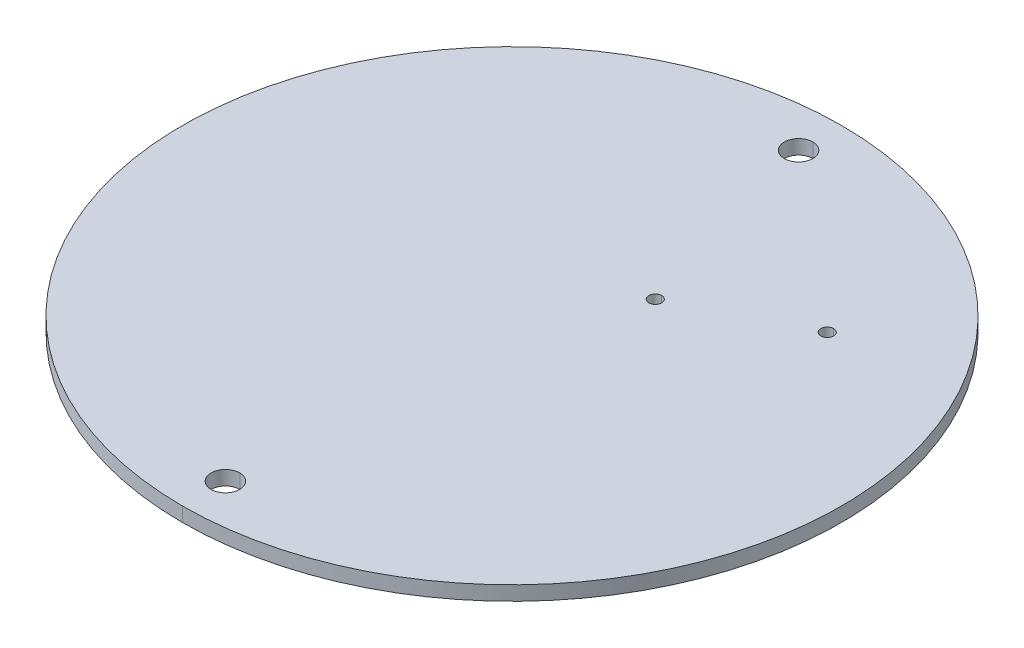
ISO-10303-21;
HEADER;
FILE_DESCRIPTION(('STEP AP214'),'2;1');
FILE_NAME('part.step','',(''),(''),'','','');
FILE_SCHEMA(('AUTOMOTIVE_DESIGN { 1 0 10303 214 1 1 1 1 }'));
ENDSEC;
DATA;
#1=APPLICATION_CONTEXT('core data for automotive mechanical design processes');
#2=APPLICATION_PROTOCOL_DEFINITION('international standard','automotive_design',2000,#1);
#3=PRODUCT_CONTEXT('',#1,'mechanical');
#4=PRODUCT('Part','Part','',(#3));
#5=PRODUCT_RELATED_PRODUCT_CATEGORY('part','',(#4));
#6=PRODUCT_DEFINITION_FORMATION('','',#4);
#7=PRODUCT_DEFINITION_CONTEXT('part definition',#1,'design');
#8=PRODUCT_DEFINITION('design','',#6,#7);
#9=PRODUCT_DEFINITION_SHAPE('','',#8);
#10=(LENGTH_UNIT() NAMED_UNIT(*) SI_UNIT(.MILLI.,.METRE.));
#11=(NAMED_UNIT(*) PLANE_ANGLE_UNIT() SI_UNIT($,.RADIAN.));
#12=(NAMED_UNIT(*) SI_UNIT($,.STERADIAN.) SOLID_ANGLE_UNIT());
#13=UNCERTAINTY_MEASURE_WITH_UNIT(LENGTH_MEASURE(1.E-05),#10,'distance_accuracy_value','');
#14=(GEOMETRIC_REPRESENTATION_CONTEXT(3) GLOBAL_UNCERTAINTY_ASSIGNED_CONTEXT((#13)) GLOBAL_UNIT_ASSIGNED_CONTEXT((#10,
#11,#12)) REPRESENTATION_CONTEXT('',''));
#15=CARTESIAN_POINT('',(0.,0.,0.));
#16=DIRECTION('',(0.,0.,1.));
#17=DIRECTION('',(1.,0.,0.));
#18=AXIS2_PLACEMENT_3D('',#15,#16,#17);
#19=CARTESIAN_POINT('',(12.7,0.,-19.05));
#20=DIRECTION('',(0.,1.,0.));
#21=DIRECTION('',(0.,0.,1.));
#22=AXIS2_PLACEMENT_3D('',#19,#20,#21);
#23=CYLINDRICAL_SURFACE('',#22,1.4224);
#24=DIRECTION('',(0.,1.,0.));
#25=VECTOR('',#24,1.);
#26=CARTESIAN_POINT('',(12.7,0.,-20.4724));
#27=LINE('',#26,#25);
#28=CARTESIAN_POINT('',(12.7,0.,-20.4724));
#29=VERTEX_POINT('',#28);
#30=CARTESIAN_POINT('',(12.7,3.175,-20.4724));
#31=VERTEX_POINT('',#30);
#32=EDGE_CURVE('E155',#29,#31,#27,.T.);
#33=ORIENTED_EDGE('',*,*,#32,.F.);
#34=CARTESIAN_POINT('',(12.7,0.,-19.05));
#35=DIRECTION('',(0.,1.,0.));
#36=DIRECTION('',(0.,0.,1.));
#37=AXIS2_PLACEMENT_3D('',#34,#35,#36);
#38=CIRCLE('',#37,1.4224);
#39=CARTESIAN_POINT('',(12.7,0.,-17.6276));
#40=VERTEX_POINT('',#39);
#41=EDGE_CURVE('E150',#40,#29,#38,.T.);
#42=ORIENTED_EDGE('',*,*,#41,.F.);
#43=DIRECTION('',(0.,1.,0.));
#44=VECTOR('',#43,1.);
#45=CARTESIAN_POINT('',(12.7,0.,-17.6276));
#46=LINE('',#45,#44);
#47=CARTESIAN_POINT('',(12.7,3.175,-17.6276));
#48=VERTEX_POINT('',#47);
#49=EDGE_CURVE('E132',#40,#48,#46,.T.);
#50=ORIENTED_EDGE('',*,*,#49,.T.);
#51=CARTESIAN_POINT('',(12.7,3.175,-19.05));
#52=DIRECTION('',(0.,1.,0.));
#53=DIRECTION('',(0.,0.,1.));
#54=AXIS2_PLACEMENT_3D('',#51,#52,#53);
#55=CIRCLE('',#54,1.4224);
#56=EDGE_CURVE('E169',#48,#31,#55,.T.);
#57=ORIENTED_EDGE('',*,*,#56,.T.);
#58=EDGE_LOOP('',(#33,#42,#50,#57));
#59=FACE_BOUND('',#58,.T.);
#60=ADVANCED_FACE('F16',(#59),#23,.F.);
#61=CARTESIAN_POINT('',(38.1,0.,-31.75));
#62=DIRECTION('',(0.,1.,0.));
#63=DIRECTION('',(0.,0.,1.));
#64=AXIS2_PLACEMENT_3D('',#61,#62,#63);
#65=CYLINDRICAL_SURFACE('',#64,1.4224);
#66=DIRECTION('',(0.,1.,0.));
#67=VECTOR('',#66,1.);
#68=CARTESIAN_POINT('',(38.1,0.,-33.1724));
#69=LINE('',#68,#67);
#70=CARTESIAN_POINT('',(38.1,0.,-33.1724));
#71=VERTEX_POINT('',#70);
#72=CARTESIAN_POINT('',(38.1,3.175,-33.1724));
#73=VERTEX_POINT('',#72);
#74=EDGE_CURVE('E143',#71,#73,#69,.T.);
#75=ORIENTED_EDGE('',*,*,#74,.F.);
#76=CARTESIAN_POINT('',(38.1,0.,-31.75));
#77=DIRECTION('',(0.,1.,0.));
#78=DIRECTION('',(0.,0.,1.));
#79=AXIS2_PLACEMENT_3D('',#76,#77,#78);
#80=CIRCLE('',#79,1.4224);
#81=CARTESIAN_POINT('',(38.1,0.,-30.3276));
#82=VERTEX_POINT('',#81);
#83=EDGE_CURVE('E181',#82,#71,#80,.T.);
#84=ORIENTED_EDGE('',*,*,#83,.F.);
#85=DIRECTION('',(0.,1.,0.));
#86=VECTOR('',#85,1.);
#87=CARTESIAN_POINT('',(38.1,0.,-30.3276));
#88=LINE('',#87,#86);
#89=CARTESIAN_POINT('',(38.1,3.175,-30.3276));
#90=VERTEX_POINT('',#89);
#91=EDGE_CURVE('E175',#82,#90,#88,.T.);
#92=ORIENTED_EDGE('',*,*,#91,.T.);
#93=CARTESIAN_POINT('',(38.1,3.175,-31.75));
#94=DIRECTION('',(0.,1.,0.));
#95=DIRECTION('',(0.,0.,1.));
#96=AXIS2_PLACEMENT_3D('',#93,#94,#95);
#97=CIRCLE('',#96,1.4224);
#98=EDGE_CURVE('E166',#90,#73,#97,.T.);
#99=ORIENTED_EDGE('',*,*,#98,.T.);
#100=EDGE_LOOP('',(#75,#84,#92,#99));
#101=FACE_BOUND('',#100,.T.);
#102=ADVANCED_FACE('F251',(#101),#65,.F.);
#103=CARTESIAN_POINT('',(0.,0.,63.5));
#104=DIRECTION('',(0.,1.,0.));
#105=DIRECTION('',(0.,0.,1.));
#106=AXIS2_PLACEMENT_3D('',#103,#104,#105);
#107=CYLINDRICAL_SURFACE('',#106,3.175);
#108=DIRECTION('',(0.,1.,0.));
#109=VECTOR('',#108,1.);
#110=CARTESIAN_POINT('',(0.,0.,60.325));
#111=LINE('',#110,#109);
#112=CARTESIAN_POINT('',(0.,0.,60.325));
#113=VERTEX_POINT('',#112);
#114=CARTESIAN_POINT('',(0.,3.175,60.325));
#115=VERTEX_POINT('',#114);
#116=EDGE_CURVE('E180',#113,#115,#111,.T.);
#117=ORIENTED_EDGE('',*,*,#116,.F.);
#118=CARTESIAN_POINT('',(0.,0.,63.5));
#119=DIRECTION('',(0.,1.,0.));
#120=DIRECTION('',(0.,0.,1.));
#121=AXIS2_PLACEMENT_3D('',#118,#119,#120);
#122=CIRCLE('',#121,3.175);
#123=CARTESIAN_POINT('',(0.,0.,66.675));
#124=VERTEX_POINT('',#123);
#125=EDGE_CURVE('E27',#124,#113,#122,.T.);
#126=ORIENTED_EDGE('',*,*,#125,.F.);
#127=DIRECTION('',(0.,1.,0.));
#128=VECTOR('',#127,1.);
#129=CARTESIAN_POINT('',(0.,0.,66.675));
#130=LINE('',#129,#128);
#131=CARTESIAN_POINT('',(0.,3.175,66.675));
#132=VERTEX_POINT('',#131);
#133=EDGE_CURVE('E122',#124,#132,#130,.T.);
#134=ORIENTED_EDGE('',*,*,#133,.T.);
#135=CARTESIAN_POINT('',(0.,3.175,63.5));
#136=DIRECTION('',(0.,1.,0.));
#137=DIRECTION('',(0.,0.,1.));
#138=AXIS2_PLACEMENT_3D('',#135,#136,#137);
#139=CIRCLE('',#138,3.175);
#140=EDGE_CURVE('E20',#132,#115,#139,.T.);
#141=ORIENTED_EDGE('',*,*,#140,.T.);
#142=EDGE_LOOP('',(#117,#126,#134,#141));
#143=FACE_BOUND('',#142,.T.);
#144=ADVANCED_FACE('F277',(#143),#107,.F.);
#145=CARTESIAN_POINT('',(4.43418130033078E-13,0.,-63.5));
#146=DIRECTION('',(0.,1.,0.));
#147=DIRECTION('',(0.,0.,1.));
#148=AXIS2_PLACEMENT_3D('',#145,#146,#147);
#149=CYLINDRICAL_SURFACE('',#148,3.175);
#150=DIRECTION('',(0.,1.,0.));
#151=VECTOR('',#150,1.);
#152=CARTESIAN_POINT('',(4.43806955391807E-13,0.,-66.675));
#153=LINE('',#152,#151);
#154=CARTESIAN_POINT('',(4.43806955391807E-13,0.,-66.675));
#155=VERTEX_POINT('',#154);
#156=CARTESIAN_POINT('',(4.43806955391807E-13,3.175,-66.675));
#157=VERTEX_POINT('',#156);
#158=EDGE_CURVE('E109',#155,#157,#153,.T.);
#159=ORIENTED_EDGE('',*,*,#158,.F.);
#160=CARTESIAN_POINT('',(4.43418130033078E-13,0.,-63.5));
#161=DIRECTION('',(0.,1.,0.));
#162=DIRECTION('',(0.,0.,1.));
#163=AXIS2_PLACEMENT_3D('',#160,#161,#162);
#164=CIRCLE('',#163,3.175);
#165=CARTESIAN_POINT('',(4.43418130033078E-13,0.,-60.325));
#166=VERTEX_POINT('',#165);
#167=EDGE_CURVE('E11',#166,#155,#164,.T.);
#168=ORIENTED_EDGE('',*,*,#167,.F.);
#169=DIRECTION('',(0.,1.,0.));
#170=VECTOR('',#169,1.);
#171=CARTESIAN_POINT('',(4.43418130033078E-13,0.,-60.325));
#172=LINE('',#171,#170);
#173=CARTESIAN_POINT('',(4.43418130033078E-13,3.175,-60.325));
#174=VERTEX_POINT('',#173);
#175=EDGE_CURVE('E120',#166,#174,#172,.T.);
#176=ORIENTED_EDGE('',*,*,#175,.T.);
#177=CARTESIAN_POINT('',(4.43418130033078E-13,3.175,-63.5));
#178=DIRECTION('',(0.,1.,0.));
#179=DIRECTION('',(0.,0.,1.));
#180=AXIS2_PLACEMENT_3D('',#177,#178,#179);
#181=CIRCLE('',#180,3.175);
#182=EDGE_CURVE('E112',#174,#157,#181,.T.);
#183=ORIENTED_EDGE('',*,*,#182,.T.);
#184=EDGE_LOOP('',(#159,#168,#176,#183));
#185=FACE_BOUND('',#184,.T.);
#186=ADVANCED_FACE('F110',(#185),#149,.F.);
#187=CARTESIAN_POINT('',(0.,0.,0.));
#188=DIRECTION('',(0.,1.,0.));
#189=DIRECTION('',(1.,0.,0.));
#190=AXIS2_PLACEMENT_3D('',#187,#188,#189);
#191=PLANE('',#190);
#192=ORIENTED_EDGE('',*,*,#167,.T.);
#193=CARTESIAN_POINT('',(4.43418130033078E-13,0.,-63.5));
#194=DIRECTION('',(0.,1.,0.));
#195=DIRECTION('',(0.,0.,1.));
#196=AXIS2_PLACEMENT_3D('',#193,#194,#195);
#197=CIRCLE('',#196,3.175);
#198=EDGE_CURVE('E107',#155,#166,#197,.T.);
#199=ORIENTED_EDGE('',*,*,#198,.T.);
#200=EDGE_LOOP('',(#192,#199));
#201=FACE_BOUND('',#200,.T.);
#202=ORIENTED_EDGE('',*,*,#125,.T.);
#203=CARTESIAN_POINT('',(0.,0.,63.5));
#204=DIRECTION('',(0.,1.,0.));
#205=DIRECTION('',(0.,0.,1.));
#206=AXIS2_PLACEMENT_3D('',#203,#204,#205);
#207=CIRCLE('',#206,3.175);
#208=EDGE_CURVE('E189',#113,#124,#207,.T.);
#209=ORIENTED_EDGE('',*,*,#208,.T.);
#210=EDGE_LOOP('',(#202,#209));
#211=FACE_BOUND('',#210,.T.);
#212=ORIENTED_EDGE('',*,*,#83,.T.);
#213=CARTESIAN_POINT('',(38.1,0.,-31.75));
#214=DIRECTION('',(0.,1.,0.));
#215=DIRECTION('',(0.,0.,1.));
#216=AXIS2_PLACEMENT_3D('',#213,#214,#215);
#217=CIRCLE('',#216,1.4224);
#218=EDGE_CURVE('E136',#71,#82,#217,.T.);
#219=ORIENTED_EDGE('',*,*,#218,.T.);
#220=EDGE_LOOP('',(#212,#219));
#221=FACE_BOUND('',#220,.T.);
#222=ORIENTED_EDGE('',*,*,#41,.T.);
#223=CARTESIAN_POINT('',(12.7,0.,-19.05));
#224=DIRECTION('',(0.,1.,0.));
#225=DIRECTION('',(0.,0.,1.));
#226=AXIS2_PLACEMENT_3D('',#223,#224,#225);
#227=CIRCLE('',#226,1.4224);
#228=EDGE_CURVE('E151',#29,#40,#227,.T.);
#229=ORIENTED_EDGE('',*,*,#228,.T.);
#230=EDGE_LOOP('',(#222,#229));
#231=FACE_BOUND('',#230,.T.);
#232=CARTESIAN_POINT('',(0.,0.,0.));
#233=DIRECTION('',(0.,1.,0.));
#234=DIRECTION('',(0.,0.,1.));
#235=AXIS2_PLACEMENT_3D('',#232,#233,#234);
#236=CIRCLE('',#235,73.025);
#237=CARTESIAN_POINT('',(0.,0.,-73.025));
#238=VERTEX_POINT('',#237);
#239=CARTESIAN_POINT('',(0.,0.,73.025));
#240=VERTEX_POINT('',#239);
#241=EDGE_CURVE('E41',#238,#240,#236,.T.);
#242=ORIENTED_EDGE('',*,*,#241,.F.);
#243=CARTESIAN_POINT('',(0.,0.,0.));
#244=DIRECTION('',(0.,1.,0.));
#245=DIRECTION('',(0.,0.,1.));
#246=AXIS2_PLACEMENT_3D('',#243,#244,#245);
#247=CIRCLE('',#246,73.025);
#248=EDGE_CURVE('E156',#240,#238,#247,.T.);
#249=ORIENTED_EDGE('',*,*,#248,.F.);
#250=EDGE_LOOP('',(#242,#249));
#251=FACE_BOUND('',#250,.T.);
#252=ADVANCED_FACE('F104',(#201,#211,#221,#231,#251),#191,.F.);
#253=CARTESIAN_POINT('',(0.,3.175,0.));
#254=DIRECTION('',(0.,1.,0.));
#255=DIRECTION('',(1.,0.,0.));
#256=AXIS2_PLACEMENT_3D('',#253,#254,#255);
#257=PLANE('',#256);
#258=ORIENTED_EDGE('',*,*,#182,.F.);
#259=CARTESIAN_POINT('',(4.43418130033078E-13,3.175,-63.5));
#260=DIRECTION('',(0.,1.,0.));
#261=DIRECTION('',(0.,0.,1.));
#262=AXIS2_PLACEMENT_3D('',#259,#260,#261);
#263=CIRCLE('',#262,3.175);
#264=EDGE_CURVE('E117',#157,#174,#263,.T.);
#265=ORIENTED_EDGE('',*,*,#264,.F.);
#266=EDGE_LOOP('',(#258,#265));
#267=FACE_BOUND('',#266,.T.);
#268=ORIENTED_EDGE('',*,*,#140,.F.);
#269=CARTESIAN_POINT('',(0.,3.175,63.5));
#270=DIRECTION('',(0.,1.,0.));
#271=DIRECTION('',(0.,0.,1.));
#272=AXIS2_PLACEMENT_3D('',#269,#270,#271);
#273=CIRCLE('',#272,3.175);
#274=EDGE_CURVE('E129',#115,#132,#273,.T.);
#275=ORIENTED_EDGE('',*,*,#274,.F.);
#276=EDGE_LOOP('',(#268,#275));
#277=FACE_BOUND('',#276,.T.);
#278=ORIENTED_EDGE('',*,*,#98,.F.);
#279=CARTESIAN_POINT('',(38.1,3.175,-31.75));
#280=DIRECTION('',(0.,1.,0.));
#281=DIRECTION('',(0.,0.,1.));
#282=AXIS2_PLACEMENT_3D('',#279,#280,#281);
#283=CIRCLE('',#282,1.4224);
#284=EDGE_CURVE('E147',#73,#90,#283,.T.);
#285=ORIENTED_EDGE('',*,*,#284,.F.);
#286=EDGE_LOOP('',(#278,#285));
#287=FACE_BOUND('',#286,.T.);
#288=ORIENTED_EDGE('',*,*,#56,.F.);
#289=CARTESIAN_POINT('',(12.7,3.175,-19.05));
#290=DIRECTION('',(0.,1.,0.));
#291=DIRECTION('',(0.,0.,1.));
#292=AXIS2_PLACEMENT_3D('',#289,#290,#291);
#293=CIRCLE('',#292,1.4224);
#294=EDGE_CURVE('E137',#31,#48,#293,.T.);
#295=ORIENTED_EDGE('',*,*,#294,.F.);
#296=EDGE_LOOP('',(#288,#295));
#297=FACE_BOUND('',#296,.T.);
#298=CARTESIAN_POINT('',(0.,3.175,0.));
#299=DIRECTION('',(0.,1.,0.));
#300=DIRECTION('',(0.,0.,1.));
#301=AXIS2_PLACEMENT_3D('',#298,#299,#300);
#302=CIRCLE('',#301,73.025);
#303=CARTESIAN_POINT('',(0.,3.175,-73.025));
#304=VERTEX_POINT('',#303);
#305=CARTESIAN_POINT('',(0.,3.175,73.025));
#306=VERTEX_POINT('',#305);
#307=EDGE_CURVE('E138',#304,#306,#302,.T.);
#308=ORIENTED_EDGE('',*,*,#307,.T.);
#309=CARTESIAN_POINT('',(0.,3.175,0.));
#310=DIRECTION('',(0.,1.,0.));
#311=DIRECTION('',(0.,0.,1.));
#312=AXIS2_PLACEMENT_3D('',#309,#310,#311);
#313=CIRCLE('',#312,73.025);
#314=EDGE_CURVE('E199',#306,#304,#313,.T.);
#315=ORIENTED_EDGE('',*,*,#314,.T.);
#316=EDGE_LOOP('',(#308,#315));
#317=FACE_BOUND('',#316,.T.);
#318=ADVANCED_FACE('F220',(#267,#277,#287,#297,#317),#257,.T.);
#319=CARTESIAN_POINT('',(0.,3.175,0.));
#320=DIRECTION('',(0.,-1.,0.));
#321=DIRECTION('',(0.,0.,-1.));
#322=AXIS2_PLACEMENT_3D('',#319,#320,#321);
#323=CYLINDRICAL_SURFACE('',#322,73.025);
#324=DIRECTION('',(0.,-1.,0.));
#325=VECTOR('',#324,1.);
#326=CARTESIAN_POINT('',(0.,3.175,73.025));
#327=LINE('',#326,#325);
#328=EDGE_CURVE('E160',#306,#240,#327,.T.);
#329=ORIENTED_EDGE('',*,*,#328,.F.);
#330=ORIENTED_EDGE('',*,*,#307,.F.);
#331=DIRECTION('',(0.,-1.,0.));
#332=VECTOR('',#331,1.);
#333=CARTESIAN_POINT('',(0.,3.175,-73.025));
#334=LINE('',#333,#332);
#335=EDGE_CURVE('E142',#304,#238,#334,.T.);
#336=ORIENTED_EDGE('',*,*,#335,.T.);
#337=ORIENTED_EDGE('',*,*,#241,.T.);
#338=EDGE_LOOP('',(#329,#330,#336,#337));
#339=FACE_BOUND('',#338,.T.);
#340=ADVANCED_FACE('F223',(#339),#323,.T.);
#341=CARTESIAN_POINT('',(0.,3.175,0.));
#342=DIRECTION('',(0.,-1.,0.));
#343=DIRECTION('',(0.,0.,-1.));
#344=AXIS2_PLACEMENT_3D('',#341,#342,#343);
#345=CYLINDRICAL_SURFACE('',#344,73.025);
#346=ORIENTED_EDGE('',*,*,#314,.F.);
#347=ORIENTED_EDGE('',*,*,#328,.T.);
#348=ORIENTED_EDGE('',*,*,#248,.T.);
#349=ORIENTED_EDGE('',*,*,#335,.F.);
#350=EDGE_LOOP('',(#346,#347,#348,#349));
#351=FACE_BOUND('',#350,.T.);
#352=ADVANCED_FACE('F18',(#351),#345,.T.);
#353=CARTESIAN_POINT('',(4.43418130033078E-13,0.,-63.5));
#354=DIRECTION('',(0.,1.,0.));
#355=DIRECTION('',(0.,0.,1.));
#356=AXIS2_PLACEMENT_3D('',#353,#354,#355);
#357=CYLINDRICAL_SURFACE('',#356,3.175);
#358=ORIENTED_EDGE('',*,*,#198,.F.);
#359=ORIENTED_EDGE('',*,*,#158,.T.);
#360=ORIENTED_EDGE('',*,*,#264,.T.);
#361=ORIENTED_EDGE('',*,*,#175,.F.);
#362=EDGE_LOOP('',(#358,#359,#360,#361));
#363=FACE_BOUND('',#362,.T.);
#364=ADVANCED_FACE('F119',(#363),#357,.F.);
#365=CARTESIAN_POINT('',(0.,0.,63.5));
#366=DIRECTION('',(0.,1.,0.));
#367=DIRECTION('',(0.,0.,1.));
#368=AXIS2_PLACEMENT_3D('',#365,#366,#367);
#369=CYLINDRICAL_SURFACE('',#368,3.175);
#370=ORIENTED_EDGE('',*,*,#208,.F.);
#371=ORIENTED_EDGE('',*,*,#116,.T.);
#372=ORIENTED_EDGE('',*,*,#274,.T.);
#373=ORIENTED_EDGE('',*,*,#133,.F.);
#374=EDGE_LOOP('',(#370,#371,#372,#373));
#375=FACE_BOUND('',#374,.T.);
#376=ADVANCED_FACE('F280',(#375),#369,.F.);
#377=CARTESIAN_POINT('',(38.1,0.,-31.75));
#378=DIRECTION('',(0.,1.,0.));
#379=DIRECTION('',(0.,0.,1.));
#380=AXIS2_PLACEMENT_3D('',#377,#378,#379);
#381=CYLINDRICAL_SURFACE('',#380,1.4224);
#382=ORIENTED_EDGE('',*,*,#218,.F.);
#383=ORIENTED_EDGE('',*,*,#74,.T.);
#384=ORIENTED_EDGE('',*,*,#284,.T.);
#385=ORIENTED_EDGE('',*,*,#91,.F.);
#386=EDGE_LOOP('',(#382,#383,#384,#385));
#387=FACE_BOUND('',#386,.T.);
#388=ADVANCED_FACE('F255',(#387),#381,.F.);
#389=CARTESIAN_POINT('',(12.7,0.,-19.05));
#390=DIRECTION('',(0.,1.,0.));
#391=DIRECTION('',(0.,0.,1.));
#392=AXIS2_PLACEMENT_3D('',#389,#390,#391);
#393=CYLINDRICAL_SURFACE('',#392,1.4224);
#394=ORIENTED_EDGE('',*,*,#228,.F.);
#395=ORIENTED_EDGE('',*,*,#32,.T.);
#396=ORIENTED_EDGE('',*,*,#294,.T.);
#397=ORIENTED_EDGE('',*,*,#49,.F.);
#398=EDGE_LOOP('',(#394,#395,#396,#397));
#399=FACE_BOUND('',#398,.T.);
#400=ADVANCED_FACE('F264',(#399),#393,.F.);
#401=CLOSED_SHELL('',(#60,#102,#144,#186,#252,#318,#340,#352,#364,#376,#388,#400));
#402=MANIFOLD_SOLID_BREP('B1',#401);
#403=ADVANCED_BREP_SHAPE_REPRESENTATION('',(#18,#402),#14);
#404=SHAPE_DEFINITION_REPRESENTATION(#9,#403);
ENDSEC;
END-ISO-10303-21;
